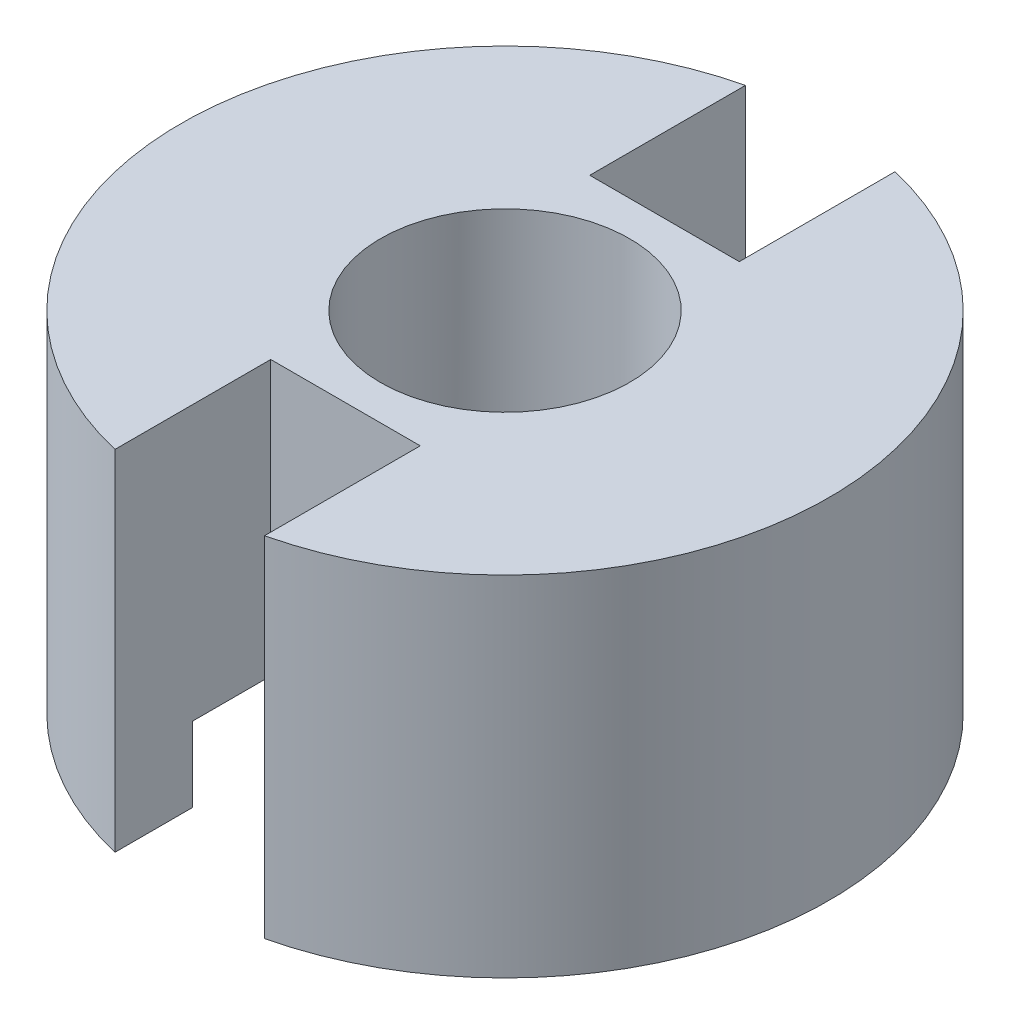
ISO-10303-21;
HEADER;
FILE_DESCRIPTION(('STEP AP214'),'2;1');
FILE_NAME('part.step','',(''),(''),'','','');
FILE_SCHEMA(('AUTOMOTIVE_DESIGN { 1 0 10303 214 1 1 1 1 }'));
ENDSEC;
DATA;
#1=APPLICATION_CONTEXT('core data for automotive mechanical design processes');
#2=APPLICATION_PROTOCOL_DEFINITION('international standard','automotive_design',2000,#1);
#3=PRODUCT_CONTEXT('',#1,'mechanical');
#4=PRODUCT('Part','Part','',(#3));
#5=PRODUCT_RELATED_PRODUCT_CATEGORY('part','',(#4));
#6=PRODUCT_DEFINITION_FORMATION('','',#4);
#7=PRODUCT_DEFINITION_CONTEXT('part definition',#1,'design');
#8=PRODUCT_DEFINITION('design','',#6,#7);
#9=PRODUCT_DEFINITION_SHAPE('','',#8);
#10=(LENGTH_UNIT() NAMED_UNIT(*) SI_UNIT(.MILLI.,.METRE.));
#11=(NAMED_UNIT(*) PLANE_ANGLE_UNIT() SI_UNIT($,.RADIAN.));
#12=(NAMED_UNIT(*) SI_UNIT($,.STERADIAN.) SOLID_ANGLE_UNIT());
#13=UNCERTAINTY_MEASURE_WITH_UNIT(LENGTH_MEASURE(1.E-05),#10,'distance_accuracy_value','');
#14=(GEOMETRIC_REPRESENTATION_CONTEXT(3) GLOBAL_UNCERTAINTY_ASSIGNED_CONTEXT((#13)) GLOBAL_UNIT_ASSIGNED_CONTEXT((#10,
#11,#12)) REPRESENTATION_CONTEXT('',''));
#15=CARTESIAN_POINT('',(0.,0.,0.));
#16=DIRECTION('',(0.,0.,1.));
#17=DIRECTION('',(1.,0.,0.));
#18=AXIS2_PLACEMENT_3D('',#15,#16,#17);
#19=CARTESIAN_POINT('',(0.,1.5,0.));
#20=DIRECTION('',(0.,-1.,0.));
#21=DIRECTION('',(0.,0.,-1.));
#22=AXIS2_PLACEMENT_3D('',#19,#20,#21);
#23=PLANE('',#22);
#24=DIRECTION('',(0.,0.,-1.));
#25=VECTOR('',#24,1.);
#26=CARTESIAN_POINT('',(-1.5,1.5,0.));
#27=LINE('',#26,#25);
#28=CARTESIAN_POINT('',(-1.5,1.5,-3.2));
#29=VERTEX_POINT('',#28);
#30=CARTESIAN_POINT('',(-1.5,1.5,-4.76969600708473));
#31=VERTEX_POINT('',#30);
#32=EDGE_CURVE('E297',#29,#31,#27,.T.);
#33=ORIENTED_EDGE('',*,*,#32,.F.);
#34=DIRECTION('',(0.,0.,-1.));
#35=VECTOR('',#34,1.);
#36=CARTESIAN_POINT('',(-1.5,1.5,-2.));
#37=LINE('',#36,#35);
#38=CARTESIAN_POINT('',(-1.5,1.5,-2.));
#39=VERTEX_POINT('',#38);
#40=EDGE_CURVE('E357',#39,#29,#37,.T.);
#41=ORIENTED_EDGE('',*,*,#40,.F.);
#42=CARTESIAN_POINT('',(0.,1.5,0.));
#43=DIRECTION('',(0.,-1.,0.));
#44=DIRECTION('',(0.,0.,-1.));
#45=AXIS2_PLACEMENT_3D('',#42,#43,#44);
#46=CIRCLE('',#45,2.5);
#47=CARTESIAN_POINT('',(-1.5,1.5,2.));
#48=VERTEX_POINT('',#47);
#49=EDGE_CURVE('E188',#48,#39,#46,.T.);
#50=ORIENTED_EDGE('',*,*,#49,.F.);
#51=DIRECTION('',(0.,0.,-1.));
#52=VECTOR('',#51,1.);
#53=CARTESIAN_POINT('',(-1.5,1.5,2.));
#54=LINE('',#53,#52);
#55=CARTESIAN_POINT('',(-1.5,1.5,3.2));
#56=VERTEX_POINT('',#55);
#57=EDGE_CURVE('E191',#56,#48,#54,.T.);
#58=ORIENTED_EDGE('',*,*,#57,.F.);
#59=DIRECTION('',(0.,0.,-1.));
#60=VECTOR('',#59,1.);
#61=CARTESIAN_POINT('',(-1.5,1.5,0.));
#62=LINE('',#61,#60);
#63=CARTESIAN_POINT('',(-1.5,1.5,4.76969600708473));
#64=VERTEX_POINT('',#63);
#65=EDGE_CURVE('E11',#64,#56,#62,.T.);
#66=ORIENTED_EDGE('',*,*,#65,.F.);
#67=CARTESIAN_POINT('',(0.,1.5,0.));
#68=DIRECTION('',(0.,-1.,0.));
#69=DIRECTION('',(0.,0.,-1.));
#70=AXIS2_PLACEMENT_3D('',#67,#68,#69);
#71=CIRCLE('',#70,5.);
#72=EDGE_CURVE('E282',#64,#31,#71,.T.);
#73=ORIENTED_EDGE('',*,*,#72,.T.);
#74=EDGE_LOOP('',(#33,#41,#50,#58,#66,#73));
#75=FACE_BOUND('',#74,.T.);
#76=ADVANCED_FACE('F36',(#75),#23,.T.);
#77=CARTESIAN_POINT('',(1.5,1.5,-2.));
#78=VERTEX_POINT('',#77);
#79=CARTESIAN_POINT('',(1.5,1.5,2.));
#80=VERTEX_POINT('',#79);
#81=EDGE_CURVE('E254',#78,#80,#46,.T.);
#82=ORIENTED_EDGE('',*,*,#81,.F.);
#83=DIRECTION('',(0.,0.,1.));
#84=VECTOR('',#83,1.);
#85=CARTESIAN_POINT('',(1.5,1.5,-3.2));
#86=LINE('',#85,#84);
#87=CARTESIAN_POINT('',(1.5,1.5,-3.2));
#88=VERTEX_POINT('',#87);
#89=EDGE_CURVE('E181',#88,#78,#86,.T.);
#90=ORIENTED_EDGE('',*,*,#89,.F.);
#91=DIRECTION('',(0.,0.,1.));
#92=VECTOR('',#91,1.);
#93=CARTESIAN_POINT('',(1.5,1.5,0.));
#94=LINE('',#93,#92);
#95=CARTESIAN_POINT('',(1.5,1.5,-4.76969600708473));
#96=VERTEX_POINT('',#95);
#97=EDGE_CURVE('E289',#96,#88,#94,.T.);
#98=ORIENTED_EDGE('',*,*,#97,.F.);
#99=CARTESIAN_POINT('',(1.5,1.5,4.76969600708473));
#100=VERTEX_POINT('',#99);
#101=EDGE_CURVE('E278',#96,#100,#71,.T.);
#102=ORIENTED_EDGE('',*,*,#101,.T.);
#103=DIRECTION('',(0.,0.,1.));
#104=VECTOR('',#103,1.);
#105=CARTESIAN_POINT('',(1.5,1.5,0.));
#106=LINE('',#105,#104);
#107=CARTESIAN_POINT('',(1.5,1.5,3.2));
#108=VERTEX_POINT('',#107);
#109=EDGE_CURVE('E44',#108,#100,#106,.T.);
#110=ORIENTED_EDGE('',*,*,#109,.F.);
#111=DIRECTION('',(0.,0.,1.));
#112=VECTOR('',#111,1.);
#113=CARTESIAN_POINT('',(1.5,1.5,3.2));
#114=LINE('',#113,#112);
#115=EDGE_CURVE('E189',#80,#108,#114,.T.);
#116=ORIENTED_EDGE('',*,*,#115,.F.);
#117=EDGE_LOOP('',(#82,#90,#98,#102,#110,#116));
#118=FACE_BOUND('',#117,.T.);
#119=ADVANCED_FACE('F310',(#118),#23,.T.);
#120=CARTESIAN_POINT('',(0.,7.,0.));
#121=DIRECTION('',(0.,-1.,0.));
#122=DIRECTION('',(0.,0.,-1.));
#123=AXIS2_PLACEMENT_3D('',#120,#121,#122);
#124=CYLINDRICAL_SURFACE('',#123,6.5);
#125=CARTESIAN_POINT('',(0.,0.,0.));
#126=DIRECTION('',(0.,1.,0.));
#127=DIRECTION('',(0.,0.,1.));
#128=AXIS2_PLACEMENT_3D('',#125,#126,#127);
#129=CIRCLE('',#128,6.5);
#130=CARTESIAN_POINT('',(-1.5,0.,-6.32455532033676));
#131=VERTEX_POINT('',#130);
#132=CARTESIAN_POINT('',(-1.5,0.,6.32455532033676));
#133=VERTEX_POINT('',#132);
#134=EDGE_CURVE('E281',#131,#133,#129,.T.);
#135=ORIENTED_EDGE('',*,*,#134,.T.);
#136=DIRECTION('',(0.,-1.,0.));
#137=VECTOR('',#136,1.);
#138=CARTESIAN_POINT('',(-1.5,7.,6.32455532033676));
#139=LINE('',#138,#137);
#140=CARTESIAN_POINT('',(-1.5,7.,6.32455532033676));
#141=VERTEX_POINT('',#140);
#142=EDGE_CURVE('E274',#133,#141,#139,.F.);
#143=ORIENTED_EDGE('',*,*,#142,.T.);
#144=CARTESIAN_POINT('',(0.,7.,0.));
#145=DIRECTION('',(0.,1.,0.));
#146=DIRECTION('',(0.,0.,1.));
#147=AXIS2_PLACEMENT_3D('',#144,#145,#146);
#148=CIRCLE('',#147,6.5);
#149=CARTESIAN_POINT('',(-1.5,7.,-6.32455532033676));
#150=VERTEX_POINT('',#149);
#151=EDGE_CURVE('E290',#150,#141,#148,.T.);
#152=ORIENTED_EDGE('',*,*,#151,.F.);
#153=DIRECTION('',(0.,-1.,0.));
#154=VECTOR('',#153,1.);
#155=CARTESIAN_POINT('',(-1.5,7.,-6.32455532033676));
#156=LINE('',#155,#154);
#157=EDGE_CURVE('E264',#150,#131,#156,.T.);
#158=ORIENTED_EDGE('',*,*,#157,.T.);
#159=EDGE_LOOP('',(#135,#143,#152,#158));
#160=FACE_BOUND('',#159,.T.);
#161=ADVANCED_FACE('F351',(#160),#124,.T.);
#162=CARTESIAN_POINT('',(0.,0.,0.));
#163=DIRECTION('',(0.,1.,0.));
#164=DIRECTION('',(0.,0.,1.));
#165=AXIS2_PLACEMENT_3D('',#162,#163,#164);
#166=PLANE('',#165);
#167=CARTESIAN_POINT('',(0.,0.,0.));
#168=DIRECTION('',(0.,-1.,0.));
#169=DIRECTION('',(0.,0.,-1.));
#170=AXIS2_PLACEMENT_3D('',#167,#168,#169);
#171=CIRCLE('',#170,5.);
#172=CARTESIAN_POINT('',(-1.5,0.,4.76969600708473));
#173=VERTEX_POINT('',#172);
#174=CARTESIAN_POINT('',(-1.5,0.,-4.76969600708473));
#175=VERTEX_POINT('',#174);
#176=EDGE_CURVE('E277',#173,#175,#171,.T.);
#177=ORIENTED_EDGE('',*,*,#176,.F.);
#178=DIRECTION('',(0.,0.,1.));
#179=VECTOR('',#178,1.);
#180=CARTESIAN_POINT('',(-1.5,0.,3.2));
#181=LINE('',#180,#179);
#182=EDGE_CURVE('E236',#173,#133,#181,.T.);
#183=ORIENTED_EDGE('',*,*,#182,.T.);
#184=ORIENTED_EDGE('',*,*,#134,.F.);
#185=DIRECTION('',(0.,0.,1.));
#186=VECTOR('',#185,1.);
#187=CARTESIAN_POINT('',(-1.5,0.,-6.7));
#188=LINE('',#187,#186);
#189=EDGE_CURVE('E216',#131,#175,#188,.T.);
#190=ORIENTED_EDGE('',*,*,#189,.T.);
#191=EDGE_LOOP('',(#177,#183,#184,#190));
#192=FACE_BOUND('',#191,.T.);
#193=ADVANCED_FACE('F348',(#192),#166,.F.);
#194=CARTESIAN_POINT('',(0.,1.5,0.));
#195=DIRECTION('',(0.,-1.,0.));
#196=DIRECTION('',(0.,0.,-1.));
#197=AXIS2_PLACEMENT_3D('',#194,#195,#196);
#198=CYLINDRICAL_SURFACE('',#197,5.);
#199=ORIENTED_EDGE('',*,*,#72,.F.);
#200=DIRECTION('',(0.,-1.,0.));
#201=VECTOR('',#200,1.);
#202=CARTESIAN_POINT('',(-1.5,1.5,4.76969600708473));
#203=LINE('',#202,#201);
#204=EDGE_CURVE('E58',#64,#173,#203,.T.);
#205=ORIENTED_EDGE('',*,*,#204,.T.);
#206=ORIENTED_EDGE('',*,*,#176,.T.);
#207=DIRECTION('',(0.,-1.,0.));
#208=VECTOR('',#207,1.);
#209=CARTESIAN_POINT('',(-1.5,1.5,-4.76969600708473));
#210=LINE('',#209,#208);
#211=EDGE_CURVE('E261',#175,#31,#210,.F.);
#212=ORIENTED_EDGE('',*,*,#211,.T.);
#213=EDGE_LOOP('',(#199,#205,#206,#212));
#214=FACE_BOUND('',#213,.T.);
#215=ADVANCED_FACE('F340',(#214),#198,.F.);
#216=CARTESIAN_POINT('',(1.5,7.,6.32455532033676));
#217=VERTEX_POINT('',#216);
#218=CARTESIAN_POINT('',(1.5,7.,-6.32455532033676));
#219=VERTEX_POINT('',#218);
#220=EDGE_CURVE('E286',#217,#219,#148,.T.);
#221=ORIENTED_EDGE('',*,*,#220,.F.);
#222=DIRECTION('',(0.,-1.,0.));
#223=VECTOR('',#222,1.);
#224=CARTESIAN_POINT('',(1.5,7.,6.32455532033676));
#225=LINE('',#224,#223);
#226=CARTESIAN_POINT('',(1.5,0.,6.32455532033676));
#227=VERTEX_POINT('',#226);
#228=EDGE_CURVE('E270',#217,#227,#225,.T.);
#229=ORIENTED_EDGE('',*,*,#228,.T.);
#230=CARTESIAN_POINT('',(1.5,0.,-6.32455532033676));
#231=VERTEX_POINT('',#230);
#232=EDGE_CURVE('E291',#227,#231,#129,.T.);
#233=ORIENTED_EDGE('',*,*,#232,.T.);
#234=DIRECTION('',(0.,-1.,0.));
#235=VECTOR('',#234,1.);
#236=CARTESIAN_POINT('',(1.5,7.,-6.32455532033676));
#237=LINE('',#236,#235);
#238=EDGE_CURVE('E258',#231,#219,#237,.F.);
#239=ORIENTED_EDGE('',*,*,#238,.T.);
#240=EDGE_LOOP('',(#221,#229,#233,#239));
#241=FACE_BOUND('',#240,.T.);
#242=ADVANCED_FACE('F38',(#241),#124,.T.);
#243=CARTESIAN_POINT('',(0.,7.,0.));
#244=DIRECTION('',(0.,1.,0.));
#245=DIRECTION('',(0.,0.,1.));
#246=AXIS2_PLACEMENT_3D('',#243,#244,#245);
#247=PLANE('',#246);
#248=DIRECTION('',(0.,0.,1.));
#249=VECTOR('',#248,1.);
#250=CARTESIAN_POINT('',(-1.5,7.,3.2));
#251=LINE('',#250,#249);
#252=CARTESIAN_POINT('',(-1.5,7.,3.2));
#253=VERTEX_POINT('',#252);
#254=EDGE_CURVE('E215',#253,#141,#251,.T.);
#255=ORIENTED_EDGE('',*,*,#254,.F.);
#256=DIRECTION('',(-1.,0.,0.));
#257=VECTOR('',#256,1.);
#258=CARTESIAN_POINT('',(-1.5,7.,3.2));
#259=LINE('',#258,#257);
#260=CARTESIAN_POINT('',(1.5,7.,3.2));
#261=VERTEX_POINT('',#260);
#262=EDGE_CURVE('E240',#261,#253,#259,.T.);
#263=ORIENTED_EDGE('',*,*,#262,.F.);
#264=DIRECTION('',(0.,0.,-1.));
#265=VECTOR('',#264,1.);
#266=CARTESIAN_POINT('',(1.5,7.,3.2));
#267=LINE('',#266,#265);
#268=EDGE_CURVE('E245',#217,#261,#267,.T.);
#269=ORIENTED_EDGE('',*,*,#268,.F.);
#270=ORIENTED_EDGE('',*,*,#220,.T.);
#271=DIRECTION('',(0.,0.,-1.));
#272=VECTOR('',#271,1.);
#273=CARTESIAN_POINT('',(1.5,7.,-6.7));
#274=LINE('',#273,#272);
#275=CARTESIAN_POINT('',(1.5,7.,-3.2));
#276=VERTEX_POINT('',#275);
#277=EDGE_CURVE('E220',#276,#219,#274,.T.);
#278=ORIENTED_EDGE('',*,*,#277,.F.);
#279=DIRECTION('',(1.,0.,0.));
#280=VECTOR('',#279,1.);
#281=CARTESIAN_POINT('',(-1.5,7.,-3.2));
#282=LINE('',#281,#280);
#283=CARTESIAN_POINT('',(-1.5,7.,-3.2));
#284=VERTEX_POINT('',#283);
#285=EDGE_CURVE('E226',#284,#276,#282,.T.);
#286=ORIENTED_EDGE('',*,*,#285,.F.);
#287=DIRECTION('',(0.,0.,1.));
#288=VECTOR('',#287,1.);
#289=CARTESIAN_POINT('',(-1.5,7.,-6.7));
#290=LINE('',#289,#288);
#291=EDGE_CURVE('E224',#150,#284,#290,.T.);
#292=ORIENTED_EDGE('',*,*,#291,.F.);
#293=ORIENTED_EDGE('',*,*,#151,.T.);
#294=EDGE_LOOP('',(#255,#263,#269,#270,#278,#286,#292,#293));
#295=FACE_BOUND('',#294,.T.);
#296=CARTESIAN_POINT('',(0.,7.,0.));
#297=DIRECTION('',(0.,1.,0.));
#298=DIRECTION('',(0.,0.,1.));
#299=AXIS2_PLACEMENT_3D('',#296,#297,#298);
#300=CIRCLE('',#299,2.5);
#301=CARTESIAN_POINT('',(0.,7.,2.5));
#302=VERTEX_POINT('',#301);
#303=EDGE_CURVE('E233',#302,#302,#300,.T.);
#304=ORIENTED_EDGE('',*,*,#303,.F.);
#305=EDGE_LOOP('',(#304));
#306=FACE_BOUND('',#305,.T.);
#307=ADVANCED_FACE('F324',(#295,#306),#247,.T.);
#308=ORIENTED_EDGE('',*,*,#232,.F.);
#309=DIRECTION('',(0.,0.,-1.));
#310=VECTOR('',#309,1.);
#311=CARTESIAN_POINT('',(1.5,0.,3.2));
#312=LINE('',#311,#310);
#313=CARTESIAN_POINT('',(1.5,0.,4.76969600708473));
#314=VERTEX_POINT('',#313);
#315=EDGE_CURVE('E239',#227,#314,#312,.T.);
#316=ORIENTED_EDGE('',*,*,#315,.T.);
#317=CARTESIAN_POINT('',(1.5,0.,-4.76969600708473));
#318=VERTEX_POINT('',#317);
#319=EDGE_CURVE('E283',#318,#314,#171,.T.);
#320=ORIENTED_EDGE('',*,*,#319,.F.);
#321=DIRECTION('',(0.,0.,-1.));
#322=VECTOR('',#321,1.);
#323=CARTESIAN_POINT('',(1.5,0.,-6.7));
#324=LINE('',#323,#322);
#325=EDGE_CURVE('E219',#318,#231,#324,.T.);
#326=ORIENTED_EDGE('',*,*,#325,.T.);
#327=EDGE_LOOP('',(#308,#316,#320,#326));
#328=FACE_BOUND('',#327,.T.);
#329=ADVANCED_FACE('F317',(#328),#166,.F.);
#330=ORIENTED_EDGE('',*,*,#319,.T.);
#331=DIRECTION('',(0.,-1.,0.));
#332=VECTOR('',#331,1.);
#333=CARTESIAN_POINT('',(1.5,1.5,4.76969600708473));
#334=LINE('',#333,#332);
#335=EDGE_CURVE('E267',#314,#100,#334,.F.);
#336=ORIENTED_EDGE('',*,*,#335,.T.);
#337=ORIENTED_EDGE('',*,*,#101,.F.);
#338=DIRECTION('',(0.,-1.,0.));
#339=VECTOR('',#338,1.);
#340=CARTESIAN_POINT('',(1.5,1.5,-4.76969600708473));
#341=LINE('',#340,#339);
#342=EDGE_CURVE('E255',#96,#318,#341,.T.);
#343=ORIENTED_EDGE('',*,*,#342,.T.);
#344=EDGE_LOOP('',(#330,#336,#337,#343));
#345=FACE_BOUND('',#344,.T.);
#346=ADVANCED_FACE('F306',(#345),#198,.F.);
#347=CARTESIAN_POINT('',(0.,0.,0.));
#348=DIRECTION('',(0.,1.,0.));
#349=DIRECTION('',(0.,0.,1.));
#350=AXIS2_PLACEMENT_3D('',#347,#348,#349);
#351=CYLINDRICAL_SURFACE('',#350,2.5);
#352=ORIENTED_EDGE('',*,*,#49,.T.);
#353=DIRECTION('',(0.,1.,0.));
#354=VECTOR('',#353,1.);
#355=CARTESIAN_POINT('',(-1.5,0.,-2.));
#356=LINE('',#355,#354);
#357=CARTESIAN_POINT('',(-1.5,0.,-2.));
#358=VERTEX_POINT('',#357);
#359=EDGE_CURVE('E166',#358,#39,#356,.T.);
#360=ORIENTED_EDGE('',*,*,#359,.F.);
#361=CARTESIAN_POINT('',(0.,0.,0.));
#362=DIRECTION('',(0.,1.,0.));
#363=DIRECTION('',(0.,0.,-1.));
#364=AXIS2_PLACEMENT_3D('',#361,#362,#363);
#365=CIRCLE('',#364,2.5);
#366=CARTESIAN_POINT('',(1.5,0.,-2.));
#367=VERTEX_POINT('',#366);
#368=EDGE_CURVE('E172',#367,#358,#365,.T.);
#369=ORIENTED_EDGE('',*,*,#368,.F.);
#370=DIRECTION('',(0.,1.,0.));
#371=VECTOR('',#370,1.);
#372=CARTESIAN_POINT('',(1.5,0.,-2.));
#373=LINE('',#372,#371);
#374=EDGE_CURVE('E363',#367,#78,#373,.T.);
#375=ORIENTED_EDGE('',*,*,#374,.T.);
#376=ORIENTED_EDGE('',*,*,#81,.T.);
#377=DIRECTION('',(0.,1.,0.));
#378=VECTOR('',#377,1.);
#379=CARTESIAN_POINT('',(1.5,0.,2.));
#380=LINE('',#379,#378);
#381=CARTESIAN_POINT('',(1.5,0.,2.));
#382=VERTEX_POINT('',#381);
#383=EDGE_CURVE('E212',#382,#80,#380,.T.);
#384=ORIENTED_EDGE('',*,*,#383,.F.);
#385=CARTESIAN_POINT('',(0.,0.,0.));
#386=DIRECTION('',(0.,1.,0.));
#387=DIRECTION('',(0.,0.,-1.));
#388=AXIS2_PLACEMENT_3D('',#385,#386,#387);
#389=CIRCLE('',#388,2.5);
#390=CARTESIAN_POINT('',(-1.5,0.,2.));
#391=VERTEX_POINT('',#390);
#392=EDGE_CURVE('E197',#391,#382,#389,.T.);
#393=ORIENTED_EDGE('',*,*,#392,.F.);
#394=DIRECTION('',(0.,1.,0.));
#395=VECTOR('',#394,1.);
#396=CARTESIAN_POINT('',(-1.5,0.,2.));
#397=LINE('',#396,#395);
#398=EDGE_CURVE('E205',#391,#48,#397,.T.);
#399=ORIENTED_EDGE('',*,*,#398,.T.);
#400=EDGE_LOOP('',(#352,#360,#369,#375,#376,#384,#393,#399));
#401=FACE_BOUND('',#400,.T.);
#402=ORIENTED_EDGE('',*,*,#303,.T.);
#403=EDGE_LOOP('',(#402));
#404=FACE_BOUND('',#403,.T.);
#405=ADVANCED_FACE('F184',(#401,#404),#351,.F.);
#406=CARTESIAN_POINT('',(-1.5,0.,-6.7));
#407=DIRECTION('',(-1.,0.,0.));
#408=DIRECTION('',(0.,0.,1.));
#409=AXIS2_PLACEMENT_3D('',#406,#407,#408);
#410=PLANE('',#409);
#411=ORIENTED_EDGE('',*,*,#291,.T.);
#412=DIRECTION('',(0.,1.,0.));
#413=VECTOR('',#412,1.);
#414=CARTESIAN_POINT('',(-1.5,0.,-3.2));
#415=LINE('',#414,#413);
#416=EDGE_CURVE('E223',#29,#284,#415,.T.);
#417=ORIENTED_EDGE('',*,*,#416,.F.);
#418=ORIENTED_EDGE('',*,*,#32,.T.);
#419=ORIENTED_EDGE('',*,*,#211,.F.);
#420=ORIENTED_EDGE('',*,*,#189,.F.);
#421=ORIENTED_EDGE('',*,*,#157,.F.);
#422=EDGE_LOOP('',(#411,#417,#418,#419,#420,#421));
#423=FACE_BOUND('',#422,.T.);
#424=ADVANCED_FACE('F344',(#423),#410,.F.);
#425=CARTESIAN_POINT('',(1.5,0.,-6.7));
#426=DIRECTION('',(1.,0.,0.));
#427=DIRECTION('',(0.,0.,-1.));
#428=AXIS2_PLACEMENT_3D('',#425,#426,#427);
#429=PLANE('',#428);
#430=ORIENTED_EDGE('',*,*,#325,.F.);
#431=ORIENTED_EDGE('',*,*,#342,.F.);
#432=ORIENTED_EDGE('',*,*,#97,.T.);
#433=DIRECTION('',(0.,1.,0.));
#434=VECTOR('',#433,1.);
#435=CARTESIAN_POINT('',(1.5,0.,-3.2));
#436=LINE('',#435,#434);
#437=EDGE_CURVE('E231',#88,#276,#436,.T.);
#438=ORIENTED_EDGE('',*,*,#437,.T.);
#439=ORIENTED_EDGE('',*,*,#277,.T.);
#440=ORIENTED_EDGE('',*,*,#238,.F.);
#441=EDGE_LOOP('',(#430,#431,#432,#438,#439,#440));
#442=FACE_BOUND('',#441,.T.);
#443=ADVANCED_FACE('F314',(#442),#429,.F.);
#444=CARTESIAN_POINT('',(-1.5,0.,-3.2));
#445=DIRECTION('',(0.,0.,1.));
#446=DIRECTION('',(1.,0.,0.));
#447=AXIS2_PLACEMENT_3D('',#444,#445,#446);
#448=PLANE('',#447);
#449=ORIENTED_EDGE('',*,*,#437,.F.);
#450=DIRECTION('',(0.,1.,0.));
#451=VECTOR('',#450,1.);
#452=CARTESIAN_POINT('',(1.5,0.,-3.2));
#453=LINE('',#452,#451);
#454=CARTESIAN_POINT('',(1.5,0.,-3.2));
#455=VERTEX_POINT('',#454);
#456=EDGE_CURVE('E193',#455,#88,#453,.T.);
#457=ORIENTED_EDGE('',*,*,#456,.F.);
#458=DIRECTION('',(1.,0.,0.));
#459=VECTOR('',#458,1.);
#460=CARTESIAN_POINT('',(-1.5,0.,-3.2));
#461=LINE('',#460,#459);
#462=CARTESIAN_POINT('',(-1.5,0.,-3.2));
#463=VERTEX_POINT('',#462);
#464=EDGE_CURVE('E171',#463,#455,#461,.T.);
#465=ORIENTED_EDGE('',*,*,#464,.F.);
#466=DIRECTION('',(0.,1.,0.));
#467=VECTOR('',#466,1.);
#468=CARTESIAN_POINT('',(-1.5,0.,-3.2));
#469=LINE('',#468,#467);
#470=EDGE_CURVE('E168',#463,#29,#469,.T.);
#471=ORIENTED_EDGE('',*,*,#470,.T.);
#472=ORIENTED_EDGE('',*,*,#416,.T.);
#473=ORIENTED_EDGE('',*,*,#285,.T.);
#474=EDGE_LOOP('',(#449,#457,#465,#471,#472,#473));
#475=FACE_BOUND('',#474,.T.);
#476=ADVANCED_FACE('F355',(#475),#448,.F.);
#477=CARTESIAN_POINT('',(-1.5,0.,3.2));
#478=DIRECTION('',(-1.,0.,0.));
#479=DIRECTION('',(0.,0.,1.));
#480=AXIS2_PLACEMENT_3D('',#477,#478,#479);
#481=PLANE('',#480);
#482=ORIENTED_EDGE('',*,*,#182,.F.);
#483=ORIENTED_EDGE('',*,*,#204,.F.);
#484=ORIENTED_EDGE('',*,*,#65,.T.);
#485=DIRECTION('',(0.,1.,0.));
#486=VECTOR('',#485,1.);
#487=CARTESIAN_POINT('',(-1.5,0.,3.2));
#488=LINE('',#487,#486);
#489=EDGE_CURVE('E227',#56,#253,#488,.T.);
#490=ORIENTED_EDGE('',*,*,#489,.T.);
#491=ORIENTED_EDGE('',*,*,#254,.T.);
#492=ORIENTED_EDGE('',*,*,#142,.F.);
#493=EDGE_LOOP('',(#482,#483,#484,#490,#491,#492));
#494=FACE_BOUND('',#493,.T.);
#495=ADVANCED_FACE('F333',(#494),#481,.F.);
#496=CARTESIAN_POINT('',(1.5,0.,3.2));
#497=DIRECTION('',(1.,0.,0.));
#498=DIRECTION('',(0.,0.,-1.));
#499=AXIS2_PLACEMENT_3D('',#496,#497,#498);
#500=PLANE('',#499);
#501=ORIENTED_EDGE('',*,*,#268,.T.);
#502=DIRECTION('',(0.,1.,0.));
#503=VECTOR('',#502,1.);
#504=CARTESIAN_POINT('',(1.5,0.,3.2));
#505=LINE('',#504,#503);
#506=EDGE_CURVE('E243',#108,#261,#505,.T.);
#507=ORIENTED_EDGE('',*,*,#506,.F.);
#508=ORIENTED_EDGE('',*,*,#109,.T.);
#509=ORIENTED_EDGE('',*,*,#335,.F.);
#510=ORIENTED_EDGE('',*,*,#315,.F.);
#511=ORIENTED_EDGE('',*,*,#228,.F.);
#512=EDGE_LOOP('',(#501,#507,#508,#509,#510,#511));
#513=FACE_BOUND('',#512,.T.);
#514=ADVANCED_FACE('F301',(#513),#500,.F.);
#515=CARTESIAN_POINT('',(-1.5,0.,3.2));
#516=DIRECTION('',(0.,0.,-1.));
#517=DIRECTION('',(-1.,0.,0.));
#518=AXIS2_PLACEMENT_3D('',#515,#516,#517);
#519=PLANE('',#518);
#520=ORIENTED_EDGE('',*,*,#489,.F.);
#521=DIRECTION('',(0.,1.,0.));
#522=VECTOR('',#521,1.);
#523=CARTESIAN_POINT('',(-1.5,0.,3.2));
#524=LINE('',#523,#522);
#525=CARTESIAN_POINT('',(-1.5,0.,3.2));
#526=VERTEX_POINT('',#525);
#527=EDGE_CURVE('E209',#526,#56,#524,.T.);
#528=ORIENTED_EDGE('',*,*,#527,.F.);
#529=DIRECTION('',(-1.,0.,0.));
#530=VECTOR('',#529,1.);
#531=CARTESIAN_POINT('',(-1.5,0.,3.2));
#532=LINE('',#531,#530);
#533=CARTESIAN_POINT('',(1.5,0.,3.2));
#534=VERTEX_POINT('',#533);
#535=EDGE_CURVE('E202',#534,#526,#532,.T.);
#536=ORIENTED_EDGE('',*,*,#535,.F.);
#537=DIRECTION('',(0.,1.,0.));
#538=VECTOR('',#537,1.);
#539=CARTESIAN_POINT('',(1.5,0.,3.2));
#540=LINE('',#539,#538);
#541=EDGE_CURVE('E51',#534,#108,#540,.T.);
#542=ORIENTED_EDGE('',*,*,#541,.T.);
#543=ORIENTED_EDGE('',*,*,#506,.T.);
#544=ORIENTED_EDGE('',*,*,#262,.T.);
#545=EDGE_LOOP('',(#520,#528,#536,#542,#543,#544));
#546=FACE_BOUND('',#545,.T.);
#547=ADVANCED_FACE('F330',(#546),#519,.F.);
#548=CARTESIAN_POINT('',(1.5,0.,3.2));
#549=DIRECTION('',(-1.,0.,0.));
#550=DIRECTION('',(0.,0.,1.));
#551=AXIS2_PLACEMENT_3D('',#548,#549,#550);
#552=PLANE('',#551);
#553=ORIENTED_EDGE('',*,*,#115,.T.);
#554=ORIENTED_EDGE('',*,*,#541,.F.);
#555=DIRECTION('',(0.,0.,1.));
#556=VECTOR('',#555,1.);
#557=CARTESIAN_POINT('',(1.5,0.,3.2));
#558=LINE('',#557,#556);
#559=EDGE_CURVE('E200',#382,#534,#558,.T.);
#560=ORIENTED_EDGE('',*,*,#559,.F.);
#561=ORIENTED_EDGE('',*,*,#383,.T.);
#562=EDGE_LOOP('',(#553,#554,#560,#561));
#563=FACE_BOUND('',#562,.T.);
#564=ADVANCED_FACE('F368',(#563),#552,.F.);
#565=CARTESIAN_POINT('',(-1.5,0.,2.));
#566=DIRECTION('',(1.,0.,0.));
#567=DIRECTION('',(0.,0.,-1.));
#568=AXIS2_PLACEMENT_3D('',#565,#566,#567);
#569=PLANE('',#568);
#570=ORIENTED_EDGE('',*,*,#57,.T.);
#571=ORIENTED_EDGE('',*,*,#398,.F.);
#572=DIRECTION('',(0.,0.,-1.));
#573=VECTOR('',#572,1.);
#574=CARTESIAN_POINT('',(-1.5,0.,2.));
#575=LINE('',#574,#573);
#576=EDGE_CURVE('E204',#526,#391,#575,.T.);
#577=ORIENTED_EDGE('',*,*,#576,.F.);
#578=ORIENTED_EDGE('',*,*,#527,.T.);
#579=EDGE_LOOP('',(#570,#571,#577,#578));
#580=FACE_BOUND('',#579,.T.);
#581=ADVANCED_FACE('F374',(#580),#569,.F.);
#582=CARTESIAN_POINT('',(0.,0.,0.));
#583=DIRECTION('',(0.,-1.,0.));
#584=DIRECTION('',(0.,0.,-1.));
#585=AXIS2_PLACEMENT_3D('',#582,#583,#584);
#586=PLANE('',#585);
#587=ORIENTED_EDGE('',*,*,#392,.T.);
#588=ORIENTED_EDGE('',*,*,#559,.T.);
#589=ORIENTED_EDGE('',*,*,#535,.T.);
#590=ORIENTED_EDGE('',*,*,#576,.T.);
#591=EDGE_LOOP('',(#587,#588,#589,#590));
#592=FACE_BOUND('',#591,.T.);
#593=ADVANCED_FACE('F372',(#592),#586,.T.);
#594=CARTESIAN_POINT('',(-1.5,0.,-2.));
#595=DIRECTION('',(1.,0.,0.));
#596=DIRECTION('',(0.,0.,-1.));
#597=AXIS2_PLACEMENT_3D('',#594,#595,#596);
#598=PLANE('',#597);
#599=ORIENTED_EDGE('',*,*,#40,.T.);
#600=ORIENTED_EDGE('',*,*,#470,.F.);
#601=DIRECTION('',(0.,0.,-1.));
#602=VECTOR('',#601,1.);
#603=CARTESIAN_POINT('',(-1.5,0.,-2.));
#604=LINE('',#603,#602);
#605=EDGE_CURVE('E161',#358,#463,#604,.T.);
#606=ORIENTED_EDGE('',*,*,#605,.F.);
#607=ORIENTED_EDGE('',*,*,#359,.T.);
#608=EDGE_LOOP('',(#599,#600,#606,#607));
#609=FACE_BOUND('',#608,.T.);
#610=ADVANCED_FACE('F164',(#609),#598,.F.);
#611=CARTESIAN_POINT('',(1.5,0.,-3.2));
#612=DIRECTION('',(-1.,0.,0.));
#613=DIRECTION('',(0.,0.,1.));
#614=AXIS2_PLACEMENT_3D('',#611,#612,#613);
#615=PLANE('',#614);
#616=ORIENTED_EDGE('',*,*,#89,.T.);
#617=ORIENTED_EDGE('',*,*,#374,.F.);
#618=DIRECTION('',(0.,0.,1.));
#619=VECTOR('',#618,1.);
#620=CARTESIAN_POINT('',(1.5,0.,-3.2));
#621=LINE('',#620,#619);
#622=EDGE_CURVE('E177',#455,#367,#621,.T.);
#623=ORIENTED_EDGE('',*,*,#622,.F.);
#624=ORIENTED_EDGE('',*,*,#456,.T.);
#625=EDGE_LOOP('',(#616,#617,#623,#624));
#626=FACE_BOUND('',#625,.T.);
#627=ADVANCED_FACE('F365',(#626),#615,.F.);
#628=CARTESIAN_POINT('',(0.,0.,0.));
#629=DIRECTION('',(0.,-1.,0.));
#630=DIRECTION('',(0.,0.,-1.));
#631=AXIS2_PLACEMENT_3D('',#628,#629,#630);
#632=PLANE('',#631);
#633=ORIENTED_EDGE('',*,*,#368,.T.);
#634=ORIENTED_EDGE('',*,*,#605,.T.);
#635=ORIENTED_EDGE('',*,*,#464,.T.);
#636=ORIENTED_EDGE('',*,*,#622,.T.);
#637=EDGE_LOOP('',(#633,#634,#635,#636));
#638=FACE_BOUND('',#637,.T.);
#639=ADVANCED_FACE('F175',(#638),#632,.T.);
#640=CLOSED_SHELL('',(#76,#119,#161,#193,#215,#242,#307,#329,#346,#405,#424,#443,#476,#495,#514,
#547,#564,#581,#593,#610,#627,#639));
#641=MANIFOLD_SOLID_BREP('B2',#640);
#642=ADVANCED_BREP_SHAPE_REPRESENTATION('',(#18,#641),#14);
#643=SHAPE_DEFINITION_REPRESENTATION(#9,#642);
ENDSEC;
END-ISO-10303-21;
